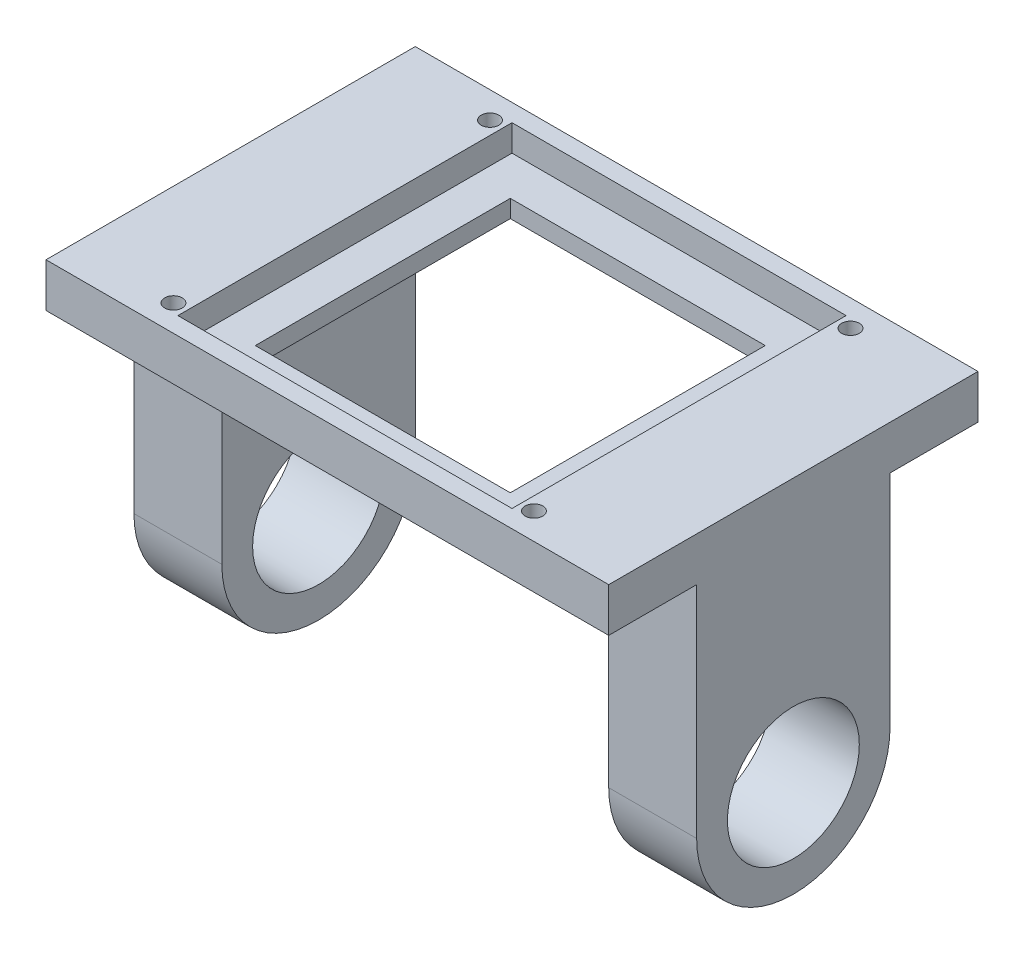
ISO-10303-21;
HEADER;
FILE_DESCRIPTION(('STEP AP214'),'2;1');
FILE_NAME('part.step','',(''),(''),'','','');
FILE_SCHEMA(('AUTOMOTIVE_DESIGN { 1 0 10303 214 1 1 1 1 }'));
ENDSEC;
DATA;
#1=APPLICATION_CONTEXT('core data for automotive mechanical design processes');
#2=APPLICATION_PROTOCOL_DEFINITION('international standard','automotive_design',2000,#1);
#3=PRODUCT_CONTEXT('',#1,'mechanical');
#4=PRODUCT('Part','Part','',(#3));
#5=PRODUCT_RELATED_PRODUCT_CATEGORY('part','',(#4));
#6=PRODUCT_DEFINITION_FORMATION('','',#4);
#7=PRODUCT_DEFINITION_CONTEXT('part definition',#1,'design');
#8=PRODUCT_DEFINITION('design','',#6,#7);
#9=PRODUCT_DEFINITION_SHAPE('','',#8);
#10=(LENGTH_UNIT() NAMED_UNIT(*) SI_UNIT(.MILLI.,.METRE.));
#11=(NAMED_UNIT(*) PLANE_ANGLE_UNIT() SI_UNIT($,.RADIAN.));
#12=(NAMED_UNIT(*) SI_UNIT($,.STERADIAN.) SOLID_ANGLE_UNIT());
#13=UNCERTAINTY_MEASURE_WITH_UNIT(LENGTH_MEASURE(1.E-05),#10,'distance_accuracy_value','');
#14=(GEOMETRIC_REPRESENTATION_CONTEXT(3) GLOBAL_UNCERTAINTY_ASSIGNED_CONTEXT((#13)) GLOBAL_UNIT_ASSIGNED_CONTEXT((#10,
#11,#12)) REPRESENTATION_CONTEXT('',''));
#15=CARTESIAN_POINT('',(0.,0.,0.));
#16=DIRECTION('',(0.,0.,1.));
#17=DIRECTION('',(1.,0.,0.));
#18=AXIS2_PLACEMENT_3D('',#15,#16,#17);
#19=CARTESIAN_POINT('',(-42.5,27.,18.002647660039));
#20=DIRECTION('',(0.,1.,0.));
#21=DIRECTION('',(0.,0.,1.));
#22=AXIS2_PLACEMENT_3D('',#19,#20,#21);
#23=PLANE('',#22);
#24=CARTESIAN_POINT('',(-42.5,27.,18.002647660039));
#25=DIRECTION('',(0.,1.,0.));
#26=DIRECTION('',(0.,0.,1.));
#27=AXIS2_PLACEMENT_3D('',#24,#25,#26);
#28=CIRCLE('',#27,1.00264766003897);
#29=CARTESIAN_POINT('',(-42.5,27.,19.0052953200779));
#30=VERTEX_POINT('',#29);
#31=EDGE_CURVE('E12',#30,#30,#28,.T.);
#32=ORIENTED_EDGE('',*,*,#31,.T.);
#33=EDGE_LOOP('',(#32));
#34=FACE_BOUND('',#33,.T.);
#35=ADVANCED_FACE('F46',(#34),#23,.T.);
#36=CARTESIAN_POINT('',(-42.5,27.,18.002647660039));
#37=DIRECTION('',(0.,1.,0.));
#38=DIRECTION('',(0.,0.,1.));
#39=AXIS2_PLACEMENT_3D('',#36,#37,#38);
#40=CYLINDRICAL_SURFACE('',#39,1.00264766003897);
#41=ORIENTED_EDGE('',*,*,#31,.F.);
#42=EDGE_LOOP('',(#41));
#43=FACE_BOUND('',#42,.T.);
#44=CARTESIAN_POINT('',(-42.5,30.,18.002647660039));
#45=DIRECTION('',(0.,1.,0.));
#46=DIRECTION('',(0.,0.,1.));
#47=AXIS2_PLACEMENT_3D('',#44,#45,#46);
#48=CIRCLE('',#47,1.00264766003897);
#49=CARTESIAN_POINT('',(-42.5,30.,19.0052953200779));
#50=VERTEX_POINT('',#49);
#51=EDGE_CURVE('E53',#50,#50,#48,.T.);
#52=ORIENTED_EDGE('',*,*,#51,.T.);
#53=EDGE_LOOP('',(#52));
#54=FACE_BOUND('',#53,.T.);
#55=ADVANCED_FACE('F366',(#43,#54),#40,.F.);
#56=CARTESIAN_POINT('',(-42.5,27.,-17.997352339961));
#57=DIRECTION('',(0.,1.,0.));
#58=DIRECTION('',(0.,0.,1.));
#59=AXIS2_PLACEMENT_3D('',#56,#57,#58);
#60=PLANE('',#59);
#61=CARTESIAN_POINT('',(-42.5,27.,-17.997352339961));
#62=DIRECTION('',(0.,1.,0.));
#63=DIRECTION('',(0.,0.,1.));
#64=AXIS2_PLACEMENT_3D('',#61,#62,#63);
#65=CIRCLE('',#64,1.00264766003897);
#66=CARTESIAN_POINT('',(-42.5,27.,-16.9947046799221));
#67=VERTEX_POINT('',#66);
#68=EDGE_CURVE('E361',#67,#67,#65,.T.);
#69=ORIENTED_EDGE('',*,*,#68,.T.);
#70=EDGE_LOOP('',(#69));
#71=FACE_BOUND('',#70,.T.);
#72=ADVANCED_FACE('F396',(#71),#60,.T.);
#73=CARTESIAN_POINT('',(-42.5,27.,-17.997352339961));
#74=DIRECTION('',(0.,1.,0.));
#75=DIRECTION('',(0.,0.,1.));
#76=AXIS2_PLACEMENT_3D('',#73,#74,#75);
#77=CYLINDRICAL_SURFACE('',#76,1.00264766003897);
#78=ORIENTED_EDGE('',*,*,#68,.F.);
#79=EDGE_LOOP('',(#78));
#80=FACE_BOUND('',#79,.T.);
#81=CARTESIAN_POINT('',(-42.5,30.,-17.997352339961));
#82=DIRECTION('',(0.,1.,0.));
#83=DIRECTION('',(0.,0.,1.));
#84=AXIS2_PLACEMENT_3D('',#81,#82,#83);
#85=CIRCLE('',#84,1.00264766003897);
#86=CARTESIAN_POINT('',(-42.5,30.,-16.9947046799221));
#87=VERTEX_POINT('',#86);
#88=EDGE_CURVE('E358',#87,#87,#85,.T.);
#89=ORIENTED_EDGE('',*,*,#88,.T.);
#90=EDGE_LOOP('',(#89));
#91=FACE_BOUND('',#90,.T.);
#92=ADVANCED_FACE('F402',(#80,#91),#77,.F.);
#93=CARTESIAN_POINT('',(0.,25.,21.));
#94=DIRECTION('',(0.,1.,0.));
#95=DIRECTION('',(0.,0.,1.));
#96=AXIS2_PLACEMENT_3D('',#93,#94,#95);
#97=PLANE('',#96);
#98=DIRECTION('',(1.,0.,0.));
#99=VECTOR('',#98,1.);
#100=CARTESIAN_POINT('',(-36.6449502720448,25.,14.549169749019));
#101=LINE('',#100,#99);
#102=CARTESIAN_POINT('',(-36.6449502720448,25.,14.549169749019));
#103=VERTEX_POINT('',#102);
#104=CARTESIAN_POINT('',(-7.64495027204475,25.,14.549169749019));
#105=VERTEX_POINT('',#104);
#106=EDGE_CURVE('E193',#103,#105,#101,.T.);
#107=ORIENTED_EDGE('',*,*,#106,.T.);
#108=DIRECTION('',(0.,0.,-1.));
#109=VECTOR('',#108,1.);
#110=CARTESIAN_POINT('',(-7.64495027204475,25.,14.549169749019));
#111=LINE('',#110,#109);
#112=CARTESIAN_POINT('',(-7.64495027204475,25.,-14.450830250981));
#113=VERTEX_POINT('',#112);
#114=EDGE_CURVE('E185',#105,#113,#111,.T.);
#115=ORIENTED_EDGE('',*,*,#114,.T.);
#116=DIRECTION('',(-1.,0.,0.));
#117=VECTOR('',#116,1.);
#118=CARTESIAN_POINT('',(-36.6449502720448,25.,-14.450830250981));
#119=LINE('',#118,#117);
#120=CARTESIAN_POINT('',(-36.6449502720448,25.,-14.450830250981));
#121=VERTEX_POINT('',#120);
#122=EDGE_CURVE('E196',#113,#121,#119,.T.);
#123=ORIENTED_EDGE('',*,*,#122,.T.);
#124=DIRECTION('',(0.,0.,1.));
#125=VECTOR('',#124,1.);
#126=CARTESIAN_POINT('',(-36.6449502720448,25.,14.549169749019));
#127=LINE('',#126,#125);
#128=EDGE_CURVE('E65',#121,#103,#127,.T.);
#129=ORIENTED_EDGE('',*,*,#128,.T.);
#130=EDGE_LOOP('',(#107,#115,#123,#129));
#131=FACE_BOUND('',#130,.T.);
#132=DIRECTION('',(1.,0.,0.));
#133=VECTOR('',#132,1.);
#134=CARTESIAN_POINT('',(0.,25.,-11.));
#135=LINE('',#134,#133);
#136=CARTESIAN_POINT('',(-54.,25.,-11.));
#137=VERTEX_POINT('',#136);
#138=CARTESIAN_POINT('',(-44.,25.,-11.));
#139=VERTEX_POINT('',#138);
#140=EDGE_CURVE('E284',#137,#139,#135,.T.);
#141=ORIENTED_EDGE('',*,*,#140,.F.);
#142=DIRECTION('',(0.,0.,1.));
#143=VECTOR('',#142,1.);
#144=CARTESIAN_POINT('',(-54.,25.,-21.));
#145=LINE('',#144,#143);
#146=CARTESIAN_POINT('',(-54.,25.,-21.));
#147=VERTEX_POINT('',#146);
#148=EDGE_CURVE('E290',#147,#137,#145,.T.);
#149=ORIENTED_EDGE('',*,*,#148,.F.);
#150=DIRECTION('',(-1.,0.,0.));
#151=VECTOR('',#150,1.);
#152=CARTESIAN_POINT('',(10.,25.,-21.));
#153=LINE('',#152,#151);
#154=CARTESIAN_POINT('',(10.,25.,-21.));
#155=VERTEX_POINT('',#154);
#156=EDGE_CURVE('E306',#155,#147,#153,.T.);
#157=ORIENTED_EDGE('',*,*,#156,.F.);
#158=DIRECTION('',(0.,0.,1.));
#159=VECTOR('',#158,1.);
#160=CARTESIAN_POINT('',(10.,25.,-21.));
#161=LINE('',#160,#159);
#162=CARTESIAN_POINT('',(10.,25.,-11.));
#163=VERTEX_POINT('',#162);
#164=EDGE_CURVE('E311',#155,#163,#161,.T.);
#165=ORIENTED_EDGE('',*,*,#164,.T.);
#166=DIRECTION('',(-1.,0.,0.));
#167=VECTOR('',#166,1.);
#168=CARTESIAN_POINT('',(10.,25.,-11.));
#169=LINE('',#168,#167);
#170=CARTESIAN_POINT('',(0.,25.,-11.));
#171=VERTEX_POINT('',#170);
#172=EDGE_CURVE('E298',#163,#171,#169,.T.);
#173=ORIENTED_EDGE('',*,*,#172,.T.);
#174=DIRECTION('',(0.,0.,1.));
#175=VECTOR('',#174,1.);
#176=CARTESIAN_POINT('',(0.,25.,-21.));
#177=LINE('',#176,#175);
#178=CARTESIAN_POINT('',(0.,25.,11.));
#179=VERTEX_POINT('',#178);
#180=EDGE_CURVE('E299',#171,#179,#177,.T.);
#181=ORIENTED_EDGE('',*,*,#180,.T.);
#182=DIRECTION('',(1.,0.,0.));
#183=VECTOR('',#182,1.);
#184=CARTESIAN_POINT('',(0.,25.,11.));
#185=LINE('',#184,#183);
#186=CARTESIAN_POINT('',(10.,25.,11.));
#187=VERTEX_POINT('',#186);
#188=EDGE_CURVE('E315',#179,#187,#185,.T.);
#189=ORIENTED_EDGE('',*,*,#188,.T.);
#190=DIRECTION('',(0.,0.,-1.));
#191=VECTOR('',#190,1.);
#192=CARTESIAN_POINT('',(10.,25.,21.));
#193=LINE('',#192,#191);
#194=CARTESIAN_POINT('',(10.,25.,21.));
#195=VERTEX_POINT('',#194);
#196=EDGE_CURVE('E323',#195,#187,#193,.T.);
#197=ORIENTED_EDGE('',*,*,#196,.F.);
#198=DIRECTION('',(1.,0.,0.));
#199=VECTOR('',#198,1.);
#200=CARTESIAN_POINT('',(0.,25.,21.));
#201=LINE('',#200,#199);
#202=CARTESIAN_POINT('',(-54.,25.,21.));
#203=VERTEX_POINT('',#202);
#204=EDGE_CURVE('E316',#203,#195,#201,.T.);
#205=ORIENTED_EDGE('',*,*,#204,.F.);
#206=CARTESIAN_POINT('',(-54.,25.,11.));
#207=VERTEX_POINT('',#206);
#208=EDGE_CURVE('E289',#207,#203,#145,.T.);
#209=ORIENTED_EDGE('',*,*,#208,.F.);
#210=DIRECTION('',(-1.,0.,0.));
#211=VECTOR('',#210,1.);
#212=CARTESIAN_POINT('',(0.,25.,11.));
#213=LINE('',#212,#211);
#214=CARTESIAN_POINT('',(-44.,25.,11.));
#215=VERTEX_POINT('',#214);
#216=EDGE_CURVE('E281',#215,#207,#213,.T.);
#217=ORIENTED_EDGE('',*,*,#216,.F.);
#218=DIRECTION('',(0.,0.,-1.));
#219=VECTOR('',#218,1.);
#220=CARTESIAN_POINT('',(-44.,25.,21.));
#221=LINE('',#220,#219);
#222=EDGE_CURVE('E301',#215,#139,#221,.T.);
#223=ORIENTED_EDGE('',*,*,#222,.T.);
#224=EDGE_LOOP('',(#141,#149,#157,#165,#173,#181,#189,#197,#205,#209,#217,#223));
#225=FACE_BOUND('',#224,.T.);
#226=ADVANCED_FACE('F200',(#131,#225),#97,.F.);
#227=CARTESIAN_POINT('',(0.,0.,0.));
#228=DIRECTION('',(1.,0.,0.));
#229=DIRECTION('',(0.,0.,-1.));
#230=AXIS2_PLACEMENT_3D('',#227,#228,#229);
#231=PLANE('',#230);
#232=CARTESIAN_POINT('',(0.,0.,0.));
#233=DIRECTION('',(1.,0.,0.));
#234=DIRECTION('',(0.,0.,-1.));
#235=AXIS2_PLACEMENT_3D('',#232,#233,#234);
#236=CIRCLE('',#235,7.5);
#237=CARTESIAN_POINT('',(0.,0.,-7.5));
#238=VERTEX_POINT('',#237);
#239=EDGE_CURVE('E346',#238,#238,#236,.T.);
#240=ORIENTED_EDGE('',*,*,#239,.T.);
#241=EDGE_LOOP('',(#240));
#242=FACE_BOUND('',#241,.T.);
#243=ORIENTED_EDGE('',*,*,#180,.F.);
#244=DIRECTION('',(0.,1.,0.));
#245=VECTOR('',#244,1.);
#246=CARTESIAN_POINT('',(0.,0.,-11.));
#247=LINE('',#246,#245);
#248=CARTESIAN_POINT('',(0.,0.,-11.));
#249=VERTEX_POINT('',#248);
#250=EDGE_CURVE('E328',#249,#171,#247,.T.);
#251=ORIENTED_EDGE('',*,*,#250,.F.);
#252=CARTESIAN_POINT('',(0.,0.,0.));
#253=DIRECTION('',(1.,0.,0.));
#254=DIRECTION('',(0.,0.,-1.));
#255=AXIS2_PLACEMENT_3D('',#252,#253,#254);
#256=CIRCLE('',#255,11.);
#257=CARTESIAN_POINT('',(0.,0.,11.));
#258=VERTEX_POINT('',#257);
#259=EDGE_CURVE('E350',#258,#249,#256,.T.);
#260=ORIENTED_EDGE('',*,*,#259,.F.);
#261=DIRECTION('',(0.,-1.,0.));
#262=VECTOR('',#261,1.);
#263=CARTESIAN_POINT('',(0.,0.,11.));
#264=LINE('',#263,#262);
#265=EDGE_CURVE('E333',#179,#258,#264,.T.);
#266=ORIENTED_EDGE('',*,*,#265,.F.);
#267=EDGE_LOOP('',(#243,#251,#260,#266));
#268=FACE_BOUND('',#267,.T.);
#269=ADVANCED_FACE('F414',(#242,#268),#231,.F.);
#270=CARTESIAN_POINT('',(10.,0.,-11.));
#271=DIRECTION('',(0.,0.,1.));
#272=DIRECTION('',(1.,0.,0.));
#273=AXIS2_PLACEMENT_3D('',#270,#271,#272);
#274=PLANE('',#273);
#275=ORIENTED_EDGE('',*,*,#172,.F.);
#276=DIRECTION('',(0.,1.,0.));
#277=VECTOR('',#276,1.);
#278=CARTESIAN_POINT('',(10.,0.,-11.));
#279=LINE('',#278,#277);
#280=CARTESIAN_POINT('',(10.,0.,-11.));
#281=VERTEX_POINT('',#280);
#282=EDGE_CURVE('E329',#281,#163,#279,.T.);
#283=ORIENTED_EDGE('',*,*,#282,.F.);
#284=DIRECTION('',(-1.,0.,0.));
#285=VECTOR('',#284,1.);
#286=CARTESIAN_POINT('',(10.,0.,-11.));
#287=LINE('',#286,#285);
#288=EDGE_CURVE('E343',#281,#249,#287,.T.);
#289=ORIENTED_EDGE('',*,*,#288,.T.);
#290=ORIENTED_EDGE('',*,*,#250,.T.);
#291=EDGE_LOOP('',(#275,#283,#289,#290));
#292=FACE_BOUND('',#291,.T.);
#293=ADVANCED_FACE('F417',(#292),#274,.F.);
#294=CARTESIAN_POINT('',(10.,0.,11.));
#295=DIRECTION('',(0.,0.,-1.));
#296=DIRECTION('',(-1.,0.,0.));
#297=AXIS2_PLACEMENT_3D('',#294,#295,#296);
#298=PLANE('',#297);
#299=ORIENTED_EDGE('',*,*,#188,.F.);
#300=ORIENTED_EDGE('',*,*,#265,.T.);
#301=DIRECTION('',(-1.,0.,0.));
#302=VECTOR('',#301,1.);
#303=CARTESIAN_POINT('',(10.,0.,11.));
#304=LINE('',#303,#302);
#305=CARTESIAN_POINT('',(10.,0.,11.));
#306=VERTEX_POINT('',#305);
#307=EDGE_CURVE('E337',#306,#258,#304,.T.);
#308=ORIENTED_EDGE('',*,*,#307,.F.);
#309=DIRECTION('',(0.,-1.,0.));
#310=VECTOR('',#309,1.);
#311=CARTESIAN_POINT('',(10.,0.,11.));
#312=LINE('',#311,#310);
#313=EDGE_CURVE('E335',#187,#306,#312,.T.);
#314=ORIENTED_EDGE('',*,*,#313,.F.);
#315=EDGE_LOOP('',(#299,#300,#308,#314));
#316=FACE_BOUND('',#315,.T.);
#317=ADVANCED_FACE('F412',(#316),#298,.F.);
#318=CARTESIAN_POINT('',(10.,0.,0.));
#319=DIRECTION('',(-1.,0.,0.));
#320=DIRECTION('',(0.,0.,1.));
#321=AXIS2_PLACEMENT_3D('',#318,#319,#320);
#322=CYLINDRICAL_SURFACE('',#321,11.);
#323=ORIENTED_EDGE('',*,*,#288,.F.);
#324=CARTESIAN_POINT('',(10.,0.,0.));
#325=DIRECTION('',(1.,0.,0.));
#326=DIRECTION('',(0.,0.,-1.));
#327=AXIS2_PLACEMENT_3D('',#324,#325,#326);
#328=CIRCLE('',#327,11.);
#329=EDGE_CURVE('E302',#306,#281,#328,.T.);
#330=ORIENTED_EDGE('',*,*,#329,.F.);
#331=ORIENTED_EDGE('',*,*,#307,.T.);
#332=ORIENTED_EDGE('',*,*,#259,.T.);
#333=EDGE_LOOP('',(#323,#330,#331,#332));
#334=FACE_BOUND('',#333,.T.);
#335=ADVANCED_FACE('F409',(#334),#322,.T.);
#336=CARTESIAN_POINT('',(10.,0.,0.));
#337=DIRECTION('',(1.,0.,0.));
#338=DIRECTION('',(0.,0.,-1.));
#339=AXIS2_PLACEMENT_3D('',#336,#337,#338);
#340=PLANE('',#339);
#341=ORIENTED_EDGE('',*,*,#329,.T.);
#342=ORIENTED_EDGE('',*,*,#282,.T.);
#343=ORIENTED_EDGE('',*,*,#164,.F.);
#344=DIRECTION('',(0.,-1.,0.));
#345=VECTOR('',#344,1.);
#346=CARTESIAN_POINT('',(10.,30.,-21.));
#347=LINE('',#346,#345);
#348=CARTESIAN_POINT('',(10.,30.,-21.));
#349=VERTEX_POINT('',#348);
#350=EDGE_CURVE('E303',#349,#155,#347,.T.);
#351=ORIENTED_EDGE('',*,*,#350,.F.);
#352=DIRECTION('',(0.,0.,1.));
#353=VECTOR('',#352,1.);
#354=CARTESIAN_POINT('',(10.,30.,11.));
#355=LINE('',#354,#353);
#356=CARTESIAN_POINT('',(10.,30.,21.));
#357=VERTEX_POINT('',#356);
#358=EDGE_CURVE('E332',#349,#357,#355,.T.);
#359=ORIENTED_EDGE('',*,*,#358,.T.);
#360=DIRECTION('',(0.,1.,0.));
#361=VECTOR('',#360,1.);
#362=CARTESIAN_POINT('',(10.,30.,21.));
#363=LINE('',#362,#361);
#364=EDGE_CURVE('E318',#195,#357,#363,.T.);
#365=ORIENTED_EDGE('',*,*,#364,.F.);
#366=ORIENTED_EDGE('',*,*,#196,.T.);
#367=ORIENTED_EDGE('',*,*,#313,.T.);
#368=EDGE_LOOP('',(#341,#342,#343,#351,#359,#365,#366,#367));
#369=FACE_BOUND('',#368,.T.);
#370=CARTESIAN_POINT('',(10.,0.,0.));
#371=DIRECTION('',(1.,0.,0.));
#372=DIRECTION('',(0.,0.,-1.));
#373=AXIS2_PLACEMENT_3D('',#370,#371,#372);
#374=CIRCLE('',#373,7.5);
#375=CARTESIAN_POINT('',(10.,0.,-7.5));
#376=VERTEX_POINT('',#375);
#377=EDGE_CURVE('E347',#376,#376,#374,.T.);
#378=ORIENTED_EDGE('',*,*,#377,.F.);
#379=EDGE_LOOP('',(#378));
#380=FACE_BOUND('',#379,.T.);
#381=ADVANCED_FACE('F383',(#369,#380),#340,.T.);
#382=CARTESIAN_POINT('',(10.,0.,0.));
#383=DIRECTION('',(-1.,0.,0.));
#384=DIRECTION('',(0.,0.,1.));
#385=AXIS2_PLACEMENT_3D('',#382,#383,#384);
#386=CYLINDRICAL_SURFACE('',#385,7.5);
#387=ORIENTED_EDGE('',*,*,#377,.T.);
#388=EDGE_LOOP('',(#387));
#389=FACE_BOUND('',#388,.T.);
#390=ORIENTED_EDGE('',*,*,#239,.F.);
#391=EDGE_LOOP('',(#390));
#392=FACE_BOUND('',#391,.T.);
#393=ADVANCED_FACE('F371',(#389,#392),#386,.F.);
#394=CARTESIAN_POINT('',(10.,30.,11.));
#395=DIRECTION('',(0.,-1.,0.));
#396=DIRECTION('',(0.,0.,-1.));
#397=AXIS2_PLACEMENT_3D('',#394,#395,#396);
#398=PLANE('',#397);
#399=CARTESIAN_POINT('',(-1.50000000000001,30.,18.002647660039));
#400=DIRECTION('',(0.,1.,0.));
#401=DIRECTION('',(0.,0.,1.));
#402=AXIS2_PLACEMENT_3D('',#399,#400,#401);
#403=CIRCLE('',#402,1.00264766003897);
#404=CARTESIAN_POINT('',(-1.50000000000001,30.,19.0052953200779));
#405=VERTEX_POINT('',#404);
#406=EDGE_CURVE('E708',#405,#405,#403,.T.);
#407=ORIENTED_EDGE('',*,*,#406,.F.);
#408=EDGE_LOOP('',(#407));
#409=FACE_BOUND('',#408,.T.);
#410=CARTESIAN_POINT('',(-1.50000000000001,30.,-17.997352339961));
#411=DIRECTION('',(0.,1.,0.));
#412=DIRECTION('',(0.,0.,1.));
#413=AXIS2_PLACEMENT_3D('',#410,#411,#412);
#414=CIRCLE('',#413,1.00264766003897);
#415=CARTESIAN_POINT('',(-1.50000000000001,30.,-16.9947046799221));
#416=VERTEX_POINT('',#415);
#417=EDGE_CURVE('E208',#416,#416,#414,.T.);
#418=ORIENTED_EDGE('',*,*,#417,.F.);
#419=EDGE_LOOP('',(#418));
#420=FACE_BOUND('',#419,.T.);
#421=DIRECTION('',(1.,0.,0.));
#422=VECTOR('',#421,1.);
#423=CARTESIAN_POINT('',(-41.,30.,19.));
#424=LINE('',#423,#422);
#425=CARTESIAN_POINT('',(-41.,30.,19.));
#426=VERTEX_POINT('',#425);
#427=CARTESIAN_POINT('',(-3.00000000000001,30.,19.));
#428=VERTEX_POINT('',#427);
#429=EDGE_CURVE('E239',#426,#428,#424,.T.);
#430=ORIENTED_EDGE('',*,*,#429,.F.);
#431=DIRECTION('',(0.,0.,1.));
#432=VECTOR('',#431,1.);
#433=CARTESIAN_POINT('',(-41.,30.,-19.));
#434=LINE('',#433,#432);
#435=CARTESIAN_POINT('',(-41.,30.,-19.));
#436=VERTEX_POINT('',#435);
#437=EDGE_CURVE('E220',#436,#426,#434,.T.);
#438=ORIENTED_EDGE('',*,*,#437,.F.);
#439=DIRECTION('',(-1.,0.,0.));
#440=VECTOR('',#439,1.);
#441=CARTESIAN_POINT('',(-41.,30.,-19.));
#442=LINE('',#441,#440);
#443=CARTESIAN_POINT('',(-3.00000000000001,30.,-19.));
#444=VERTEX_POINT('',#443);
#445=EDGE_CURVE('E228',#444,#436,#442,.T.);
#446=ORIENTED_EDGE('',*,*,#445,.F.);
#447=DIRECTION('',(0.,0.,-1.));
#448=VECTOR('',#447,1.);
#449=CARTESIAN_POINT('',(-3.00000000000001,30.,-19.));
#450=LINE('',#449,#448);
#451=EDGE_CURVE('E242',#428,#444,#450,.T.);
#452=ORIENTED_EDGE('',*,*,#451,.F.);
#453=EDGE_LOOP('',(#430,#438,#446,#452));
#454=FACE_BOUND('',#453,.T.);
#455=DIRECTION('',(1.,0.,0.));
#456=VECTOR('',#455,1.);
#457=CARTESIAN_POINT('',(10.,30.,-21.));
#458=LINE('',#457,#456);
#459=CARTESIAN_POINT('',(-54.,30.,-21.));
#460=VERTEX_POINT('',#459);
#461=EDGE_CURVE('E308',#460,#349,#458,.T.);
#462=ORIENTED_EDGE('',*,*,#461,.F.);
#463=DIRECTION('',(0.,0.,-1.));
#464=VECTOR('',#463,1.);
#465=CARTESIAN_POINT('',(-54.,30.,-21.));
#466=LINE('',#465,#464);
#467=CARTESIAN_POINT('',(-54.,30.,21.));
#468=VERTEX_POINT('',#467);
#469=EDGE_CURVE('E296',#468,#460,#466,.T.);
#470=ORIENTED_EDGE('',*,*,#469,.F.);
#471=DIRECTION('',(-1.,0.,0.));
#472=VECTOR('',#471,1.);
#473=CARTESIAN_POINT('',(0.,30.,21.));
#474=LINE('',#473,#472);
#475=EDGE_CURVE('E321',#357,#468,#474,.T.);
#476=ORIENTED_EDGE('',*,*,#475,.F.);
#477=ORIENTED_EDGE('',*,*,#358,.F.);
#478=EDGE_LOOP('',(#462,#470,#476,#477));
#479=FACE_BOUND('',#478,.T.);
#480=ORIENTED_EDGE('',*,*,#88,.F.);
#481=EDGE_LOOP('',(#480));
#482=FACE_BOUND('',#481,.T.);
#483=ORIENTED_EDGE('',*,*,#51,.F.);
#484=EDGE_LOOP('',(#483));
#485=FACE_BOUND('',#484,.T.);
#486=ADVANCED_FACE('F368',(#409,#420,#454,#479,#482,#485),#398,.F.);
#487=CARTESIAN_POINT('',(0.,0.,21.));
#488=DIRECTION('',(0.,0.,1.));
#489=DIRECTION('',(1.,0.,0.));
#490=AXIS2_PLACEMENT_3D('',#487,#488,#489);
#491=PLANE('',#490);
#492=ORIENTED_EDGE('',*,*,#475,.T.);
#493=DIRECTION('',(0.,1.,0.));
#494=VECTOR('',#493,1.);
#495=CARTESIAN_POINT('',(-54.,30.,21.));
#496=LINE('',#495,#494);
#497=EDGE_CURVE('E293',#203,#468,#496,.T.);
#498=ORIENTED_EDGE('',*,*,#497,.F.);
#499=ORIENTED_EDGE('',*,*,#204,.T.);
#500=ORIENTED_EDGE('',*,*,#364,.T.);
#501=EDGE_LOOP('',(#492,#498,#499,#500));
#502=FACE_BOUND('',#501,.T.);
#503=ADVANCED_FACE('F370',(#502),#491,.T.);
#504=CARTESIAN_POINT('',(0.,0.,-21.));
#505=DIRECTION('',(0.,0.,-1.));
#506=DIRECTION('',(-1.,0.,0.));
#507=AXIS2_PLACEMENT_3D('',#504,#505,#506);
#508=PLANE('',#507);
#509=ORIENTED_EDGE('',*,*,#350,.T.);
#510=ORIENTED_EDGE('',*,*,#156,.T.);
#511=DIRECTION('',(0.,-1.,0.));
#512=VECTOR('',#511,1.);
#513=CARTESIAN_POINT('',(-54.,30.,-21.));
#514=LINE('',#513,#512);
#515=EDGE_CURVE('E286',#460,#147,#514,.T.);
#516=ORIENTED_EDGE('',*,*,#515,.F.);
#517=ORIENTED_EDGE('',*,*,#461,.T.);
#518=EDGE_LOOP('',(#509,#510,#516,#517));
#519=FACE_BOUND('',#518,.T.);
#520=ADVANCED_FACE('F379',(#519),#508,.T.);
#521=CARTESIAN_POINT('',(-54.,0.,0.));
#522=DIRECTION('',(-1.,0.,0.));
#523=DIRECTION('',(0.,0.,1.));
#524=AXIS2_PLACEMENT_3D('',#521,#522,#523);
#525=PLANE('',#524);
#526=CARTESIAN_POINT('',(-54.,0.,0.));
#527=DIRECTION('',(-1.,0.,0.));
#528=DIRECTION('',(0.,0.,1.));
#529=AXIS2_PLACEMENT_3D('',#526,#527,#528);
#530=CIRCLE('',#529,7.5);
#531=CARTESIAN_POINT('',(-54.,0.,7.5));
#532=VERTEX_POINT('',#531);
#533=EDGE_CURVE('E249',#532,#532,#530,.T.);
#534=ORIENTED_EDGE('',*,*,#533,.F.);
#535=EDGE_LOOP('',(#534));
#536=FACE_BOUND('',#535,.T.);
#537=ORIENTED_EDGE('',*,*,#469,.T.);
#538=ORIENTED_EDGE('',*,*,#515,.T.);
#539=ORIENTED_EDGE('',*,*,#148,.T.);
#540=DIRECTION('',(0.,1.,0.));
#541=VECTOR('',#540,1.);
#542=CARTESIAN_POINT('',(-54.,0.,-11.));
#543=LINE('',#542,#541);
#544=CARTESIAN_POINT('',(-54.,0.,-11.));
#545=VERTEX_POINT('',#544);
#546=EDGE_CURVE('E265',#545,#137,#543,.T.);
#547=ORIENTED_EDGE('',*,*,#546,.F.);
#548=CARTESIAN_POINT('',(-54.,0.,0.));
#549=DIRECTION('',(-1.,0.,0.));
#550=DIRECTION('',(0.,0.,1.));
#551=AXIS2_PLACEMENT_3D('',#548,#549,#550);
#552=CIRCLE('',#551,11.);
#553=CARTESIAN_POINT('',(-54.,0.,11.));
#554=VERTEX_POINT('',#553);
#555=EDGE_CURVE('E259',#545,#554,#552,.T.);
#556=ORIENTED_EDGE('',*,*,#555,.T.);
#557=DIRECTION('',(0.,-1.,0.));
#558=VECTOR('',#557,1.);
#559=CARTESIAN_POINT('',(-54.,0.,11.));
#560=LINE('',#559,#558);
#561=EDGE_CURVE('E272',#207,#554,#560,.T.);
#562=ORIENTED_EDGE('',*,*,#561,.F.);
#563=ORIENTED_EDGE('',*,*,#208,.T.);
#564=ORIENTED_EDGE('',*,*,#497,.T.);
#565=EDGE_LOOP('',(#537,#538,#539,#547,#556,#562,#563,#564));
#566=FACE_BOUND('',#565,.T.);
#567=ADVANCED_FACE('F451',(#536,#566),#525,.T.);
#568=CARTESIAN_POINT('',(-44.,0.,0.));
#569=DIRECTION('',(1.,0.,0.));
#570=DIRECTION('',(0.,0.,-1.));
#571=AXIS2_PLACEMENT_3D('',#568,#569,#570);
#572=PLANE('',#571);
#573=CARTESIAN_POINT('',(-44.,0.,0.));
#574=DIRECTION('',(-1.,0.,0.));
#575=DIRECTION('',(0.,0.,1.));
#576=AXIS2_PLACEMENT_3D('',#573,#574,#575);
#577=CIRCLE('',#576,7.5);
#578=CARTESIAN_POINT('',(-44.,0.,7.5));
#579=VERTEX_POINT('',#578);
#580=EDGE_CURVE('E256',#579,#579,#577,.T.);
#581=ORIENTED_EDGE('',*,*,#580,.T.);
#582=EDGE_LOOP('',(#581));
#583=FACE_BOUND('',#582,.T.);
#584=ORIENTED_EDGE('',*,*,#222,.F.);
#585=DIRECTION('',(0.,-1.,0.));
#586=VECTOR('',#585,1.);
#587=CARTESIAN_POINT('',(-44.,0.,11.));
#588=LINE('',#587,#586);
#589=CARTESIAN_POINT('',(-44.,0.,11.));
#590=VERTEX_POINT('',#589);
#591=EDGE_CURVE('E271',#215,#590,#588,.T.);
#592=ORIENTED_EDGE('',*,*,#591,.T.);
#593=CARTESIAN_POINT('',(-44.,0.,0.));
#594=DIRECTION('',(-1.,0.,0.));
#595=DIRECTION('',(0.,0.,1.));
#596=AXIS2_PLACEMENT_3D('',#593,#594,#595);
#597=CIRCLE('',#596,11.);
#598=CARTESIAN_POINT('',(-44.,0.,-11.));
#599=VERTEX_POINT('',#598);
#600=EDGE_CURVE('E262',#599,#590,#597,.T.);
#601=ORIENTED_EDGE('',*,*,#600,.F.);
#602=DIRECTION('',(0.,1.,0.));
#603=VECTOR('',#602,1.);
#604=CARTESIAN_POINT('',(-44.,0.,-11.));
#605=LINE('',#604,#603);
#606=EDGE_CURVE('E268',#599,#139,#605,.T.);
#607=ORIENTED_EDGE('',*,*,#606,.T.);
#608=EDGE_LOOP('',(#584,#592,#601,#607));
#609=FACE_BOUND('',#608,.T.);
#610=ADVANCED_FACE('F460',(#583,#609),#572,.T.);
#611=CARTESIAN_POINT('',(-44.,0.,-11.));
#612=DIRECTION('',(0.,0.,1.));
#613=DIRECTION('',(1.,0.,0.));
#614=AXIS2_PLACEMENT_3D('',#611,#612,#613);
#615=PLANE('',#614);
#616=ORIENTED_EDGE('',*,*,#546,.T.);
#617=ORIENTED_EDGE('',*,*,#140,.T.);
#618=ORIENTED_EDGE('',*,*,#606,.F.);
#619=DIRECTION('',(-1.,0.,0.));
#620=VECTOR('',#619,1.);
#621=CARTESIAN_POINT('',(-44.,0.,-11.));
#622=LINE('',#621,#620);
#623=EDGE_CURVE('E279',#599,#545,#622,.T.);
#624=ORIENTED_EDGE('',*,*,#623,.T.);
#625=EDGE_LOOP('',(#616,#617,#618,#624));
#626=FACE_BOUND('',#625,.T.);
#627=ADVANCED_FACE('F463',(#626),#615,.F.);
#628=CARTESIAN_POINT('',(-44.,0.,11.));
#629=DIRECTION('',(0.,0.,-1.));
#630=DIRECTION('',(-1.,0.,0.));
#631=AXIS2_PLACEMENT_3D('',#628,#629,#630);
#632=PLANE('',#631);
#633=ORIENTED_EDGE('',*,*,#591,.F.);
#634=ORIENTED_EDGE('',*,*,#216,.T.);
#635=ORIENTED_EDGE('',*,*,#561,.T.);
#636=DIRECTION('',(-1.,0.,0.));
#637=VECTOR('',#636,1.);
#638=CARTESIAN_POINT('',(-44.,0.,11.));
#639=LINE('',#638,#637);
#640=EDGE_CURVE('E274',#590,#554,#639,.T.);
#641=ORIENTED_EDGE('',*,*,#640,.F.);
#642=EDGE_LOOP('',(#633,#634,#635,#641));
#643=FACE_BOUND('',#642,.T.);
#644=ADVANCED_FACE('F456',(#643),#632,.F.);
#645=CARTESIAN_POINT('',(-44.,0.,0.));
#646=DIRECTION('',(-1.,0.,0.));
#647=DIRECTION('',(0.,0.,1.));
#648=AXIS2_PLACEMENT_3D('',#645,#646,#647);
#649=CYLINDRICAL_SURFACE('',#648,11.);
#650=ORIENTED_EDGE('',*,*,#623,.F.);
#651=ORIENTED_EDGE('',*,*,#600,.T.);
#652=ORIENTED_EDGE('',*,*,#640,.T.);
#653=ORIENTED_EDGE('',*,*,#555,.F.);
#654=EDGE_LOOP('',(#650,#651,#652,#653));
#655=FACE_BOUND('',#654,.T.);
#656=ADVANCED_FACE('F467',(#655),#649,.T.);
#657=CARTESIAN_POINT('',(-44.,0.,0.));
#658=DIRECTION('',(-1.,0.,0.));
#659=DIRECTION('',(0.,0.,1.));
#660=AXIS2_PLACEMENT_3D('',#657,#658,#659);
#661=CYLINDRICAL_SURFACE('',#660,7.5);
#662=ORIENTED_EDGE('',*,*,#580,.F.);
#663=EDGE_LOOP('',(#662));
#664=FACE_BOUND('',#663,.T.);
#665=ORIENTED_EDGE('',*,*,#533,.T.);
#666=EDGE_LOOP('',(#665));
#667=FACE_BOUND('',#666,.T.);
#668=ADVANCED_FACE('F546',(#664,#667),#661,.F.);
#669=CARTESIAN_POINT('',(-41.,27.,-19.));
#670=DIRECTION('',(-1.,0.,0.));
#671=DIRECTION('',(0.,0.,1.));
#672=AXIS2_PLACEMENT_3D('',#669,#670,#671);
#673=PLANE('',#672);
#674=ORIENTED_EDGE('',*,*,#437,.T.);
#675=DIRECTION('',(0.,1.,0.));
#676=VECTOR('',#675,1.);
#677=CARTESIAN_POINT('',(-41.,27.,19.));
#678=LINE('',#677,#676);
#679=CARTESIAN_POINT('',(-41.,27.,19.));
#680=VERTEX_POINT('',#679);
#681=EDGE_CURVE('E237',#680,#426,#678,.T.);
#682=ORIENTED_EDGE('',*,*,#681,.F.);
#683=DIRECTION('',(0.,0.,1.));
#684=VECTOR('',#683,1.);
#685=CARTESIAN_POINT('',(-41.,27.,-19.));
#686=LINE('',#685,#684);
#687=CARTESIAN_POINT('',(-41.,27.,-19.));
#688=VERTEX_POINT('',#687);
#689=EDGE_CURVE('E224',#688,#680,#686,.T.);
#690=ORIENTED_EDGE('',*,*,#689,.F.);
#691=DIRECTION('',(0.,1.,0.));
#692=VECTOR('',#691,1.);
#693=CARTESIAN_POINT('',(-41.,27.,-19.));
#694=LINE('',#693,#692);
#695=EDGE_CURVE('E247',#688,#436,#694,.T.);
#696=ORIENTED_EDGE('',*,*,#695,.T.);
#697=EDGE_LOOP('',(#674,#682,#690,#696));
#698=FACE_BOUND('',#697,.T.);
#699=ADVANCED_FACE('F569',(#698),#673,.F.);
#700=CARTESIAN_POINT('',(-41.,27.,-19.));
#701=DIRECTION('',(0.,0.,-1.));
#702=DIRECTION('',(-1.,0.,0.));
#703=AXIS2_PLACEMENT_3D('',#700,#701,#702);
#704=PLANE('',#703);
#705=ORIENTED_EDGE('',*,*,#445,.T.);
#706=ORIENTED_EDGE('',*,*,#695,.F.);
#707=DIRECTION('',(-1.,0.,0.));
#708=VECTOR('',#707,1.);
#709=CARTESIAN_POINT('',(-41.,27.,-19.));
#710=LINE('',#709,#708);
#711=CARTESIAN_POINT('',(-3.00000000000001,27.,-19.));
#712=VERTEX_POINT('',#711);
#713=EDGE_CURVE('E234',#712,#688,#710,.T.);
#714=ORIENTED_EDGE('',*,*,#713,.F.);
#715=DIRECTION('',(0.,1.,0.));
#716=VECTOR('',#715,1.);
#717=CARTESIAN_POINT('',(-3.00000000000001,27.,-19.));
#718=LINE('',#717,#716);
#719=EDGE_CURVE('E250',#712,#444,#718,.T.);
#720=ORIENTED_EDGE('',*,*,#719,.T.);
#721=EDGE_LOOP('',(#705,#706,#714,#720));
#722=FACE_BOUND('',#721,.T.);
#723=ADVANCED_FACE('F579',(#722),#704,.F.);
#724=CARTESIAN_POINT('',(-3.00000000000001,27.,-19.));
#725=DIRECTION('',(1.,0.,0.));
#726=DIRECTION('',(0.,0.,-1.));
#727=AXIS2_PLACEMENT_3D('',#724,#725,#726);
#728=PLANE('',#727);
#729=ORIENTED_EDGE('',*,*,#451,.T.);
#730=ORIENTED_EDGE('',*,*,#719,.F.);
#731=DIRECTION('',(0.,0.,-1.));
#732=VECTOR('',#731,1.);
#733=CARTESIAN_POINT('',(-3.00000000000001,27.,-19.));
#734=LINE('',#733,#732);
#735=CARTESIAN_POINT('',(-3.00000000000001,27.,19.));
#736=VERTEX_POINT('',#735);
#737=EDGE_CURVE('E231',#736,#712,#734,.T.);
#738=ORIENTED_EDGE('',*,*,#737,.F.);
#739=DIRECTION('',(0.,1.,0.));
#740=VECTOR('',#739,1.);
#741=CARTESIAN_POINT('',(-3.00000000000001,27.,19.));
#742=LINE('',#741,#740);
#743=EDGE_CURVE('E252',#736,#428,#742,.T.);
#744=ORIENTED_EDGE('',*,*,#743,.T.);
#745=EDGE_LOOP('',(#729,#730,#738,#744));
#746=FACE_BOUND('',#745,.T.);
#747=ADVANCED_FACE('F589',(#746),#728,.F.);
#748=CARTESIAN_POINT('',(-41.,27.,19.));
#749=DIRECTION('',(0.,0.,1.));
#750=DIRECTION('',(1.,0.,0.));
#751=AXIS2_PLACEMENT_3D('',#748,#749,#750);
#752=PLANE('',#751);
#753=ORIENTED_EDGE('',*,*,#429,.T.);
#754=ORIENTED_EDGE('',*,*,#743,.F.);
#755=DIRECTION('',(1.,0.,0.));
#756=VECTOR('',#755,1.);
#757=CARTESIAN_POINT('',(-41.,27.,19.));
#758=LINE('',#757,#756);
#759=EDGE_CURVE('E227',#680,#736,#758,.T.);
#760=ORIENTED_EDGE('',*,*,#759,.F.);
#761=ORIENTED_EDGE('',*,*,#681,.T.);
#762=EDGE_LOOP('',(#753,#754,#760,#761));
#763=FACE_BOUND('',#762,.T.);
#764=ADVANCED_FACE('F598',(#763),#752,.F.);
#765=CARTESIAN_POINT('',(0.,27.,0.));
#766=DIRECTION('',(0.,1.,0.));
#767=DIRECTION('',(0.,0.,1.));
#768=AXIS2_PLACEMENT_3D('',#765,#766,#767);
#769=PLANE('',#768);
#770=DIRECTION('',(0.,0.,-1.));
#771=VECTOR('',#770,1.);
#772=CARTESIAN_POINT('',(-7.64495027204475,27.,14.549169749019));
#773=LINE('',#772,#771);
#774=CARTESIAN_POINT('',(-7.64495027204475,27.,14.549169749019));
#775=VERTEX_POINT('',#774);
#776=CARTESIAN_POINT('',(-7.64495027204475,27.,-14.450830250981));
#777=VERTEX_POINT('',#776);
#778=EDGE_CURVE('E188',#775,#777,#773,.T.);
#779=ORIENTED_EDGE('',*,*,#778,.F.);
#780=DIRECTION('',(1.,0.,0.));
#781=VECTOR('',#780,1.);
#782=CARTESIAN_POINT('',(-36.6449502720448,27.,14.549169749019));
#783=LINE('',#782,#781);
#784=CARTESIAN_POINT('',(-36.6449502720448,27.,14.549169749019));
#785=VERTEX_POINT('',#784);
#786=EDGE_CURVE('E203',#785,#775,#783,.T.);
#787=ORIENTED_EDGE('',*,*,#786,.F.);
#788=DIRECTION('',(0.,0.,1.));
#789=VECTOR('',#788,1.);
#790=CARTESIAN_POINT('',(-36.6449502720448,27.,14.549169749019));
#791=LINE('',#790,#789);
#792=CARTESIAN_POINT('',(-36.6449502720448,27.,-14.450830250981));
#793=VERTEX_POINT('',#792);
#794=EDGE_CURVE('E60',#793,#785,#791,.T.);
#795=ORIENTED_EDGE('',*,*,#794,.F.);
#796=DIRECTION('',(-1.,0.,0.));
#797=VECTOR('',#796,1.);
#798=CARTESIAN_POINT('',(-36.6449502720448,27.,-14.450830250981));
#799=LINE('',#798,#797);
#800=EDGE_CURVE('E214',#777,#793,#799,.T.);
#801=ORIENTED_EDGE('',*,*,#800,.F.);
#802=EDGE_LOOP('',(#779,#787,#795,#801));
#803=FACE_BOUND('',#802,.T.);
#804=ORIENTED_EDGE('',*,*,#689,.T.);
#805=ORIENTED_EDGE('',*,*,#759,.T.);
#806=ORIENTED_EDGE('',*,*,#737,.T.);
#807=ORIENTED_EDGE('',*,*,#713,.T.);
#808=EDGE_LOOP('',(#804,#805,#806,#807));
#809=FACE_BOUND('',#808,.T.);
#810=ADVANCED_FACE('F607',(#803,#809),#769,.T.);
#811=CARTESIAN_POINT('',(-7.64495027204475,25.,14.549169749019));
#812=DIRECTION('',(1.,0.,0.));
#813=DIRECTION('',(0.,0.,-1.));
#814=AXIS2_PLACEMENT_3D('',#811,#812,#813);
#815=PLANE('',#814);
#816=ORIENTED_EDGE('',*,*,#778,.T.);
#817=DIRECTION('',(0.,1.,0.));
#818=VECTOR('',#817,1.);
#819=CARTESIAN_POINT('',(-7.64495027204475,25.,-14.450830250981));
#820=LINE('',#819,#818);
#821=EDGE_CURVE('E181',#113,#777,#820,.T.);
#822=ORIENTED_EDGE('',*,*,#821,.F.);
#823=ORIENTED_EDGE('',*,*,#114,.F.);
#824=DIRECTION('',(0.,1.,0.));
#825=VECTOR('',#824,1.);
#826=CARTESIAN_POINT('',(-7.64495027204475,25.,14.549169749019));
#827=LINE('',#826,#825);
#828=EDGE_CURVE('E218',#105,#775,#827,.T.);
#829=ORIENTED_EDGE('',*,*,#828,.T.);
#830=EDGE_LOOP('',(#816,#822,#823,#829));
#831=FACE_BOUND('',#830,.T.);
#832=ADVANCED_FACE('F183',(#831),#815,.F.);
#833=CARTESIAN_POINT('',(-36.6449502720448,25.,14.549169749019));
#834=DIRECTION('',(0.,0.,1.));
#835=DIRECTION('',(1.,0.,0.));
#836=AXIS2_PLACEMENT_3D('',#833,#834,#835);
#837=PLANE('',#836);
#838=ORIENTED_EDGE('',*,*,#786,.T.);
#839=ORIENTED_EDGE('',*,*,#828,.F.);
#840=ORIENTED_EDGE('',*,*,#106,.F.);
#841=DIRECTION('',(0.,1.,0.));
#842=VECTOR('',#841,1.);
#843=CARTESIAN_POINT('',(-36.6449502720448,25.,14.549169749019));
#844=LINE('',#843,#842);
#845=EDGE_CURVE('E221',#103,#785,#844,.T.);
#846=ORIENTED_EDGE('',*,*,#845,.T.);
#847=EDGE_LOOP('',(#838,#839,#840,#846));
#848=FACE_BOUND('',#847,.T.);
#849=ADVANCED_FACE('F623',(#848),#837,.F.);
#850=CARTESIAN_POINT('',(-36.6449502720448,25.,14.549169749019));
#851=DIRECTION('',(-1.,0.,0.));
#852=DIRECTION('',(0.,0.,1.));
#853=AXIS2_PLACEMENT_3D('',#850,#851,#852);
#854=PLANE('',#853);
#855=ORIENTED_EDGE('',*,*,#794,.T.);
#856=ORIENTED_EDGE('',*,*,#845,.F.);
#857=ORIENTED_EDGE('',*,*,#128,.F.);
#858=DIRECTION('',(0.,1.,0.));
#859=VECTOR('',#858,1.);
#860=CARTESIAN_POINT('',(-36.6449502720448,25.,-14.450830250981));
#861=LINE('',#860,#859);
#862=EDGE_CURVE('E192',#121,#793,#861,.T.);
#863=ORIENTED_EDGE('',*,*,#862,.T.);
#864=EDGE_LOOP('',(#855,#856,#857,#863));
#865=FACE_BOUND('',#864,.T.);
#866=ADVANCED_FACE('F630',(#865),#854,.F.);
#867=CARTESIAN_POINT('',(-36.6449502720448,25.,-14.450830250981));
#868=DIRECTION('',(0.,0.,-1.));
#869=DIRECTION('',(-1.,0.,0.));
#870=AXIS2_PLACEMENT_3D('',#867,#868,#869);
#871=PLANE('',#870);
#872=ORIENTED_EDGE('',*,*,#800,.T.);
#873=ORIENTED_EDGE('',*,*,#862,.F.);
#874=ORIENTED_EDGE('',*,*,#122,.F.);
#875=ORIENTED_EDGE('',*,*,#821,.T.);
#876=EDGE_LOOP('',(#872,#873,#874,#875));
#877=FACE_BOUND('',#876,.T.);
#878=ADVANCED_FACE('F197',(#877),#871,.F.);
#879=CARTESIAN_POINT('',(-1.50000000000001,27.,-17.997352339961));
#880=DIRECTION('',(0.,1.,0.));
#881=DIRECTION('',(0.,0.,1.));
#882=AXIS2_PLACEMENT_3D('',#879,#880,#881);
#883=CYLINDRICAL_SURFACE('',#882,1.00264766003897);
#884=CARTESIAN_POINT('',(-1.50000000000001,27.,-17.997352339961));
#885=DIRECTION('',(0.,1.,0.));
#886=DIRECTION('',(0.,0.,1.));
#887=AXIS2_PLACEMENT_3D('',#884,#885,#886);
#888=CIRCLE('',#887,1.00264766003897);
#889=CARTESIAN_POINT('',(-1.50000000000001,27.,-16.9947046799221));
#890=VERTEX_POINT('',#889);
#891=EDGE_CURVE('E215',#890,#890,#888,.T.);
#892=ORIENTED_EDGE('',*,*,#891,.F.);
#893=EDGE_LOOP('',(#892));
#894=FACE_BOUND('',#893,.T.);
#895=ORIENTED_EDGE('',*,*,#417,.T.);
#896=EDGE_LOOP('',(#895));
#897=FACE_BOUND('',#896,.T.);
#898=ADVANCED_FACE('F642',(#894,#897),#883,.F.);
#899=CARTESIAN_POINT('',(-1.50000000000001,27.,-17.997352339961));
#900=DIRECTION('',(0.,1.,0.));
#901=DIRECTION('',(0.,0.,1.));
#902=AXIS2_PLACEMENT_3D('',#899,#900,#901);
#903=PLANE('',#902);
#904=ORIENTED_EDGE('',*,*,#891,.T.);
#905=EDGE_LOOP('',(#904));
#906=FACE_BOUND('',#905,.T.);
#907=ADVANCED_FACE('F653',(#906),#903,.T.);
#908=CARTESIAN_POINT('',(-1.50000000000001,27.,18.002647660039));
#909=DIRECTION('',(0.,1.,0.));
#910=DIRECTION('',(0.,0.,1.));
#911=AXIS2_PLACEMENT_3D('',#908,#909,#910);
#912=CYLINDRICAL_SURFACE('',#911,1.00264766003897);
#913=CARTESIAN_POINT('',(-1.50000000000001,27.,18.002647660039));
#914=DIRECTION('',(0.,1.,0.));
#915=DIRECTION('',(0.,0.,1.));
#916=AXIS2_PLACEMENT_3D('',#913,#914,#915);
#917=CIRCLE('',#916,1.00264766003897);
#918=CARTESIAN_POINT('',(-1.50000000000001,27.,19.0052953200779));
#919=VERTEX_POINT('',#918);
#920=EDGE_CURVE('E707',#919,#919,#917,.T.);
#921=ORIENTED_EDGE('',*,*,#920,.F.);
#922=EDGE_LOOP('',(#921));
#923=FACE_BOUND('',#922,.T.);
#924=ORIENTED_EDGE('',*,*,#406,.T.);
#925=EDGE_LOOP('',(#924));
#926=FACE_BOUND('',#925,.T.);
#927=ADVANCED_FACE('F662',(#923,#926),#912,.F.);
#928=CARTESIAN_POINT('',(-1.50000000000001,27.,18.002647660039));
#929=DIRECTION('',(0.,1.,0.));
#930=DIRECTION('',(0.,0.,1.));
#931=AXIS2_PLACEMENT_3D('',#928,#929,#930);
#932=PLANE('',#931);
#933=ORIENTED_EDGE('',*,*,#920,.T.);
#934=EDGE_LOOP('',(#933));
#935=FACE_BOUND('',#934,.T.);
#936=ADVANCED_FACE('F692',(#935),#932,.T.);
#937=CLOSED_SHELL('',(#35,#55,#72,#92,#226,#269,#293,#317,#335,#381,#393,#486,#503,#520,#567,
#610,#627,#644,#656,#668,#699,#723,#747,#764,#810,#832,#849,#866,#878,#898,#907,#927,#936));
#938=MANIFOLD_SOLID_BREP('B2',#937);
#939=ADVANCED_BREP_SHAPE_REPRESENTATION('',(#18,#938),#14);
#940=SHAPE_DEFINITION_REPRESENTATION(#9,#939);
ENDSEC;
END-ISO-10303-21;
